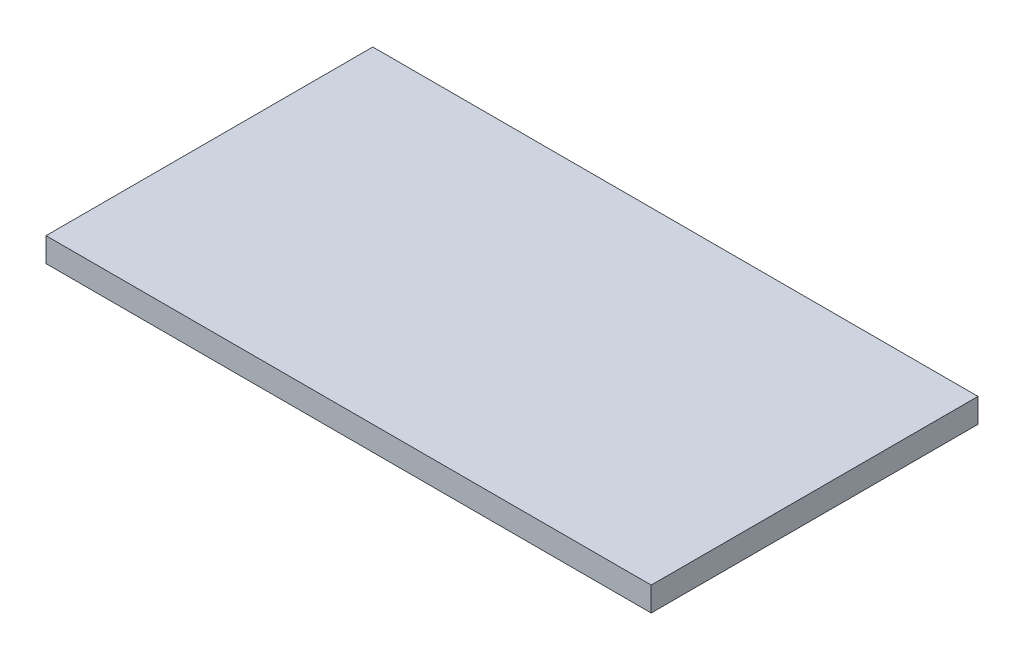
ISO-10303-21;
HEADER;
FILE_DESCRIPTION(('STEP AP214'),'2;1');
FILE_NAME('part.step','',(''),(''),'','','');
FILE_SCHEMA(('AUTOMOTIVE_DESIGN { 1 0 10303 214 1 1 1 1 }'));
ENDSEC;
DATA;
#1=APPLICATION_CONTEXT('core data for automotive mechanical design processes');
#2=APPLICATION_PROTOCOL_DEFINITION('international standard','automotive_design',2000,#1);
#3=PRODUCT_CONTEXT('',#1,'mechanical');
#4=PRODUCT('Part','Part','',(#3));
#5=PRODUCT_RELATED_PRODUCT_CATEGORY('part','',(#4));
#6=PRODUCT_DEFINITION_FORMATION('','',#4);
#7=PRODUCT_DEFINITION_CONTEXT('part definition',#1,'design');
#8=PRODUCT_DEFINITION('design','',#6,#7);
#9=PRODUCT_DEFINITION_SHAPE('','',#8);
#10=(LENGTH_UNIT() NAMED_UNIT(*) SI_UNIT(.MILLI.,.METRE.));
#11=(NAMED_UNIT(*) PLANE_ANGLE_UNIT() SI_UNIT($,.RADIAN.));
#12=(NAMED_UNIT(*) SI_UNIT($,.STERADIAN.) SOLID_ANGLE_UNIT());
#13=UNCERTAINTY_MEASURE_WITH_UNIT(LENGTH_MEASURE(1.E-05),#10,'distance_accuracy_value','');
#14=(GEOMETRIC_REPRESENTATION_CONTEXT(3) GLOBAL_UNCERTAINTY_ASSIGNED_CONTEXT((#13)) GLOBAL_UNIT_ASSIGNED_CONTEXT((#10,
#11,#12)) REPRESENTATION_CONTEXT('',''));
#15=CARTESIAN_POINT('',(0.,0.,0.));
#16=DIRECTION('',(0.,0.,1.));
#17=DIRECTION('',(1.,0.,0.));
#18=AXIS2_PLACEMENT_3D('',#15,#16,#17);
#19=CARTESIAN_POINT('',(-25.,2.,13.5));
#20=DIRECTION('',(1.,0.,0.));
#21=DIRECTION('',(0.,0.,-1.));
#22=AXIS2_PLACEMENT_3D('',#19,#20,#21);
#23=PLANE('',#22);
#24=DIRECTION('',(0.,0.,1.));
#25=VECTOR('',#24,1.);
#26=CARTESIAN_POINT('',(-25.,0.,13.5));
#27=LINE('',#26,#25);
#28=CARTESIAN_POINT('',(-25.,0.,-13.5));
#29=VERTEX_POINT('',#28);
#30=CARTESIAN_POINT('',(-25.,0.,13.5));
#31=VERTEX_POINT('',#30);
#32=EDGE_CURVE('E111',#29,#31,#27,.T.);
#33=ORIENTED_EDGE('',*,*,#32,.T.);
#34=DIRECTION('',(0.,-1.,0.));
#35=VECTOR('',#34,1.);
#36=CARTESIAN_POINT('',(-25.,2.,13.5));
#37=LINE('',#36,#35);
#38=CARTESIAN_POINT('',(-25.,2.,13.5));
#39=VERTEX_POINT('',#38);
#40=EDGE_CURVE('E11',#39,#31,#37,.T.);
#41=ORIENTED_EDGE('',*,*,#40,.F.);
#42=DIRECTION('',(0.,0.,1.));
#43=VECTOR('',#42,1.);
#44=CARTESIAN_POINT('',(-25.,2.,13.5));
#45=LINE('',#44,#43);
#46=CARTESIAN_POINT('',(-25.,2.,-13.5));
#47=VERTEX_POINT('',#46);
#48=EDGE_CURVE('E95',#47,#39,#45,.T.);
#49=ORIENTED_EDGE('',*,*,#48,.F.);
#50=DIRECTION('',(0.,-1.,0.));
#51=VECTOR('',#50,1.);
#52=CARTESIAN_POINT('',(-25.,2.,-13.5));
#53=LINE('',#52,#51);
#54=EDGE_CURVE('E107',#47,#29,#53,.T.);
#55=ORIENTED_EDGE('',*,*,#54,.T.);
#56=EDGE_LOOP('',(#33,#41,#49,#55));
#57=FACE_BOUND('',#56,.T.);
#58=ADVANCED_FACE('F43',(#57),#23,.F.);
#59=CARTESIAN_POINT('',(25.,2.,13.5));
#60=DIRECTION('',(0.,0.,-1.));
#61=DIRECTION('',(-1.,0.,0.));
#62=AXIS2_PLACEMENT_3D('',#59,#60,#61);
#63=PLANE('',#62);
#64=DIRECTION('',(1.,0.,0.));
#65=VECTOR('',#64,1.);
#66=CARTESIAN_POINT('',(25.,0.,13.5));
#67=LINE('',#66,#65);
#68=CARTESIAN_POINT('',(25.,0.,13.5));
#69=VERTEX_POINT('',#68);
#70=EDGE_CURVE('E100',#31,#69,#67,.T.);
#71=ORIENTED_EDGE('',*,*,#70,.T.);
#72=DIRECTION('',(0.,-1.,0.));
#73=VECTOR('',#72,1.);
#74=CARTESIAN_POINT('',(25.,2.,13.5));
#75=LINE('',#74,#73);
#76=CARTESIAN_POINT('',(25.,2.,13.5));
#77=VERTEX_POINT('',#76);
#78=EDGE_CURVE('E52',#77,#69,#75,.T.);
#79=ORIENTED_EDGE('',*,*,#78,.F.);
#80=DIRECTION('',(1.,0.,0.));
#81=VECTOR('',#80,1.);
#82=CARTESIAN_POINT('',(25.,2.,13.5));
#83=LINE('',#82,#81);
#84=EDGE_CURVE('E90',#39,#77,#83,.T.);
#85=ORIENTED_EDGE('',*,*,#84,.F.);
#86=ORIENTED_EDGE('',*,*,#40,.T.);
#87=EDGE_LOOP('',(#71,#79,#85,#86));
#88=FACE_BOUND('',#87,.T.);
#89=ADVANCED_FACE('F99',(#88),#63,.F.);
#90=CARTESIAN_POINT('',(25.,2.,13.5));
#91=DIRECTION('',(-1.,0.,0.));
#92=DIRECTION('',(0.,0.,1.));
#93=AXIS2_PLACEMENT_3D('',#90,#91,#92);
#94=PLANE('',#93);
#95=DIRECTION('',(0.,0.,-1.));
#96=VECTOR('',#95,1.);
#97=CARTESIAN_POINT('',(25.,0.,13.5));
#98=LINE('',#97,#96);
#99=CARTESIAN_POINT('',(25.,0.,-13.5));
#100=VERTEX_POINT('',#99);
#101=EDGE_CURVE('E77',#69,#100,#98,.T.);
#102=ORIENTED_EDGE('',*,*,#101,.T.);
#103=DIRECTION('',(0.,-1.,0.));
#104=VECTOR('',#103,1.);
#105=CARTESIAN_POINT('',(25.,2.,-13.5));
#106=LINE('',#105,#104);
#107=CARTESIAN_POINT('',(25.,2.,-13.5));
#108=VERTEX_POINT('',#107);
#109=EDGE_CURVE('E102',#108,#100,#106,.T.);
#110=ORIENTED_EDGE('',*,*,#109,.F.);
#111=DIRECTION('',(0.,0.,-1.));
#112=VECTOR('',#111,1.);
#113=CARTESIAN_POINT('',(25.,2.,13.5));
#114=LINE('',#113,#112);
#115=EDGE_CURVE('E93',#77,#108,#114,.T.);
#116=ORIENTED_EDGE('',*,*,#115,.F.);
#117=ORIENTED_EDGE('',*,*,#78,.T.);
#118=EDGE_LOOP('',(#102,#110,#116,#117));
#119=FACE_BOUND('',#118,.T.);
#120=ADVANCED_FACE('F103',(#119),#94,.F.);
#121=CARTESIAN_POINT('',(25.,2.,-13.5));
#122=DIRECTION('',(0.,0.,1.));
#123=DIRECTION('',(1.,0.,0.));
#124=AXIS2_PLACEMENT_3D('',#121,#122,#123);
#125=PLANE('',#124);
#126=DIRECTION('',(-1.,0.,0.));
#127=VECTOR('',#126,1.);
#128=CARTESIAN_POINT('',(25.,0.,-13.5));
#129=LINE('',#128,#127);
#130=EDGE_CURVE('E83',#100,#29,#129,.T.);
#131=ORIENTED_EDGE('',*,*,#130,.T.);
#132=ORIENTED_EDGE('',*,*,#54,.F.);
#133=DIRECTION('',(-1.,0.,0.));
#134=VECTOR('',#133,1.);
#135=CARTESIAN_POINT('',(25.,2.,-13.5));
#136=LINE('',#135,#134);
#137=EDGE_CURVE('E60',#108,#47,#136,.T.);
#138=ORIENTED_EDGE('',*,*,#137,.F.);
#139=ORIENTED_EDGE('',*,*,#109,.T.);
#140=EDGE_LOOP('',(#131,#132,#138,#139));
#141=FACE_BOUND('',#140,.T.);
#142=ADVANCED_FACE('F124',(#141),#125,.F.);
#143=CARTESIAN_POINT('',(0.,2.,0.));
#144=DIRECTION('',(0.,1.,0.));
#145=DIRECTION('',(0.,0.,1.));
#146=AXIS2_PLACEMENT_3D('',#143,#144,#145);
#147=PLANE('',#146);
#148=ORIENTED_EDGE('',*,*,#48,.T.);
#149=ORIENTED_EDGE('',*,*,#84,.T.);
#150=ORIENTED_EDGE('',*,*,#115,.T.);
#151=ORIENTED_EDGE('',*,*,#137,.T.);
#152=EDGE_LOOP('',(#148,#149,#150,#151));
#153=FACE_BOUND('',#152,.T.);
#154=ADVANCED_FACE('F91',(#153),#147,.T.);
#155=CARTESIAN_POINT('',(0.,0.,0.));
#156=DIRECTION('',(0.,1.,0.));
#157=DIRECTION('',(0.,0.,1.));
#158=AXIS2_PLACEMENT_3D('',#155,#156,#157);
#159=PLANE('',#158);
#160=ORIENTED_EDGE('',*,*,#32,.F.);
#161=ORIENTED_EDGE('',*,*,#130,.F.);
#162=ORIENTED_EDGE('',*,*,#101,.F.);
#163=ORIENTED_EDGE('',*,*,#70,.F.);
#164=EDGE_LOOP('',(#160,#161,#162,#163));
#165=FACE_BOUND('',#164,.T.);
#166=ADVANCED_FACE('F127',(#165),#159,.F.);
#167=CLOSED_SHELL('',(#58,#89,#120,#142,#154,#166));
#168=MANIFOLD_SOLID_BREP('B2',#167);
#169=ADVANCED_BREP_SHAPE_REPRESENTATION('',(#18,#168),#14);
#170=SHAPE_DEFINITION_REPRESENTATION(#9,#169);
ENDSEC;
END-ISO-10303-21;
